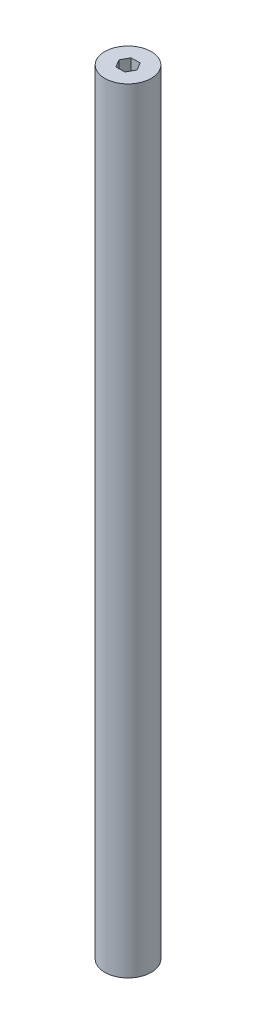
ISO-10303-21;
HEADER;
FILE_DESCRIPTION(('STEP AP214'),'2;1');
FILE_NAME('part.step','',(''),(''),'','','');
FILE_SCHEMA(('AUTOMOTIVE_DESIGN { 1 0 10303 214 1 1 1 1 }'));
ENDSEC;
DATA;
#1=APPLICATION_CONTEXT('core data for automotive mechanical design processes');
#2=APPLICATION_PROTOCOL_DEFINITION('international standard','automotive_design',2000,#1);
#3=PRODUCT_CONTEXT('',#1,'mechanical');
#4=PRODUCT('Part','Part','',(#3));
#5=PRODUCT_RELATED_PRODUCT_CATEGORY('part','',(#4));
#6=PRODUCT_DEFINITION_FORMATION('','',#4);
#7=PRODUCT_DEFINITION_CONTEXT('part definition',#1,'design');
#8=PRODUCT_DEFINITION('design','',#6,#7);
#9=PRODUCT_DEFINITION_SHAPE('','',#8);
#10=(LENGTH_UNIT() NAMED_UNIT(*) SI_UNIT(.MILLI.,.METRE.));
#11=(NAMED_UNIT(*) PLANE_ANGLE_UNIT() SI_UNIT($,.RADIAN.));
#12=(NAMED_UNIT(*) SI_UNIT($,.STERADIAN.) SOLID_ANGLE_UNIT());
#13=UNCERTAINTY_MEASURE_WITH_UNIT(LENGTH_MEASURE(1.E-05),#10,'distance_accuracy_value','');
#14=(GEOMETRIC_REPRESENTATION_CONTEXT(3) GLOBAL_UNCERTAINTY_ASSIGNED_CONTEXT((#13)) GLOBAL_UNIT_ASSIGNED_CONTEXT((#10,
#11,#12)) REPRESENTATION_CONTEXT('',''));
#15=CARTESIAN_POINT('',(0.,0.,0.));
#16=DIRECTION('',(0.,0.,1.));
#17=DIRECTION('',(1.,0.,0.));
#18=AXIS2_PLACEMENT_3D('',#15,#16,#17);
#19=CARTESIAN_POINT('',(0.,635.,0.));
#20=DIRECTION('',(0.,1.,0.));
#21=DIRECTION('',(0.,0.,1.));
#22=AXIS2_PLACEMENT_3D('',#19,#20,#21);
#23=PLANE('',#22);
#24=CARTESIAN_POINT('',(0.,635.,0.));
#25=DIRECTION('',(0.,1.,0.));
#26=DIRECTION('',(0.,0.,1.));
#27=AXIS2_PLACEMENT_3D('',#24,#25,#26);
#28=CIRCLE('',#27,19.05);
#29=CARTESIAN_POINT('',(0.,635.,-19.05));
#30=VERTEX_POINT('',#29);
#31=EDGE_CURVE('E11',#30,#30,#28,.T.);
#32=ORIENTED_EDGE('',*,*,#31,.T.);
#33=EDGE_LOOP('',(#32));
#34=FACE_BOUND('',#33,.T.);
#35=DIRECTION('',(0.485633338163928,0.,-0.874162605505269));
#36=VECTOR('',#35,1.);
#37=CARTESIAN_POINT('',(3.77051612537931,635.,6.28860409642616));
#38=LINE('',#37,#36);
#39=CARTESIAN_POINT('',(3.77051612537931,635.,6.28860409642616));
#40=VERTEX_POINT('',#39);
#41=CARTESIAN_POINT('',(7.3313489645376,635.,-0.121060701744275));
#42=VERTEX_POINT('',#41);
#43=EDGE_CURVE('E100',#40,#42,#38,.T.);
#44=ORIENTED_EDGE('',*,*,#43,.F.);
#45=DIRECTION('',(0.999863692487921,0.,-0.0165104949780338));
#46=VECTOR('',#45,1.);
#47=CARTESIAN_POINT('',(-3.56083283915829,635.,6.40966479817044));
#48=LINE('',#47,#46);
#49=CARTESIAN_POINT('',(-3.56083283915829,635.,6.40966479817044));
#50=VERTEX_POINT('',#49);
#51=EDGE_CURVE('E92',#50,#40,#48,.T.);
#52=ORIENTED_EDGE('',*,*,#51,.F.);
#53=DIRECTION('',(0.514230354323993,0.,0.857652110527235));
#54=VECTOR('',#53,1.);
#55=CARTESIAN_POINT('',(-7.3313489645376,635.,0.121060701744275));
#56=LINE('',#55,#54);
#57=CARTESIAN_POINT('',(-7.3313489645376,635.,0.121060701744275));
#58=VERTEX_POINT('',#57);
#59=EDGE_CURVE('E120',#58,#50,#56,.T.);
#60=ORIENTED_EDGE('',*,*,#59,.F.);
#61=DIRECTION('',(-0.485633338163928,0.,0.874162605505269));
#62=VECTOR('',#61,1.);
#63=CARTESIAN_POINT('',(-3.77051612537931,635.,-6.28860409642616));
#64=LINE('',#63,#62);
#65=CARTESIAN_POINT('',(-3.77051612537931,635.,-6.28860409642616));
#66=VERTEX_POINT('',#65);
#67=EDGE_CURVE('E118',#66,#58,#64,.T.);
#68=ORIENTED_EDGE('',*,*,#67,.F.);
#69=DIRECTION('',(-0.999863692487921,0.,0.0165104949780339));
#70=VECTOR('',#69,1.);
#71=CARTESIAN_POINT('',(3.56083283915829,635.,-6.40966479817044));
#72=LINE('',#71,#70);
#73=CARTESIAN_POINT('',(3.56083283915829,635.,-6.40966479817044));
#74=VERTEX_POINT('',#73);
#75=EDGE_CURVE('E114',#74,#66,#72,.T.);
#76=ORIENTED_EDGE('',*,*,#75,.F.);
#77=DIRECTION('',(-0.514230354323993,0.,-0.857652110527235));
#78=VECTOR('',#77,1.);
#79=CARTESIAN_POINT('',(7.3313489645376,635.,-0.121060701744275));
#80=LINE('',#79,#78);
#81=EDGE_CURVE('E112',#42,#74,#80,.T.);
#82=ORIENTED_EDGE('',*,*,#81,.F.);
#83=EDGE_LOOP('',(#44,#52,#60,#68,#76,#82));
#84=FACE_BOUND('',#83,.T.);
#85=ADVANCED_FACE('F39',(#34,#84),#23,.T.);
#86=CARTESIAN_POINT('',(0.,0.,0.));
#87=DIRECTION('',(0.,1.,0.));
#88=DIRECTION('',(0.,0.,1.));
#89=AXIS2_PLACEMENT_3D('',#86,#87,#88);
#90=PLANE('',#89);
#91=CARTESIAN_POINT('',(0.,0.,0.));
#92=DIRECTION('',(0.,1.,0.));
#93=DIRECTION('',(0.,0.,1.));
#94=AXIS2_PLACEMENT_3D('',#91,#92,#93);
#95=CIRCLE('',#94,19.05);
#96=CARTESIAN_POINT('',(0.,-1.11022302462516E-13,-19.05));
#97=VERTEX_POINT('',#96);
#98=EDGE_CURVE('E43',#97,#97,#95,.T.);
#99=ORIENTED_EDGE('',*,*,#98,.F.);
#100=EDGE_LOOP('',(#99));
#101=FACE_BOUND('',#100,.T.);
#102=DIRECTION('',(0.999863692487921,0.,-0.0165104949780338));
#103=VECTOR('',#102,1.);
#104=CARTESIAN_POINT('',(-3.56083283915829,0.,6.40966479817044));
#105=LINE('',#104,#103);
#106=CARTESIAN_POINT('',(-3.56083283915829,0.,6.40966479817044));
#107=VERTEX_POINT('',#106);
#108=CARTESIAN_POINT('',(3.77051612537931,0.,6.28860409642616));
#109=VERTEX_POINT('',#108);
#110=EDGE_CURVE('E62',#107,#109,#105,.T.);
#111=ORIENTED_EDGE('',*,*,#110,.T.);
#112=DIRECTION('',(0.485633338163928,0.,-0.874162605505269));
#113=VECTOR('',#112,1.);
#114=CARTESIAN_POINT('',(3.77051612537931,0.,6.28860409642616));
#115=LINE('',#114,#113);
#116=CARTESIAN_POINT('',(7.3313489645376,0.,-0.121060701744275));
#117=VERTEX_POINT('',#116);
#118=EDGE_CURVE('E107',#109,#117,#115,.T.);
#119=ORIENTED_EDGE('',*,*,#118,.T.);
#120=DIRECTION('',(-0.514230354323993,0.,-0.857652110527235));
#121=VECTOR('',#120,1.);
#122=CARTESIAN_POINT('',(7.3313489645376,0.,-0.121060701744275));
#123=LINE('',#122,#121);
#124=CARTESIAN_POINT('',(3.56083283915829,0.,-6.40966479817044));
#125=VERTEX_POINT('',#124);
#126=EDGE_CURVE('E124',#117,#125,#123,.T.);
#127=ORIENTED_EDGE('',*,*,#126,.T.);
#128=DIRECTION('',(-0.999863692487921,0.,0.0165104949780339));
#129=VECTOR('',#128,1.);
#130=CARTESIAN_POINT('',(3.56083283915829,0.,-6.40966479817044));
#131=LINE('',#130,#129);
#132=CARTESIAN_POINT('',(-3.77051612537931,0.,-6.28860409642616));
#133=VERTEX_POINT('',#132);
#134=EDGE_CURVE('E127',#125,#133,#131,.T.);
#135=ORIENTED_EDGE('',*,*,#134,.T.);
#136=DIRECTION('',(-0.485633338163928,0.,0.874162605505269));
#137=VECTOR('',#136,1.);
#138=CARTESIAN_POINT('',(-3.77051612537931,0.,-6.28860409642616));
#139=LINE('',#138,#137);
#140=CARTESIAN_POINT('',(-7.3313489645376,0.,0.121060701744275));
#141=VERTEX_POINT('',#140);
#142=EDGE_CURVE('E130',#133,#141,#139,.T.);
#143=ORIENTED_EDGE('',*,*,#142,.T.);
#144=DIRECTION('',(0.514230354323993,0.,0.857652110527235));
#145=VECTOR('',#144,1.);
#146=CARTESIAN_POINT('',(-7.3313489645376,0.,0.121060701744275));
#147=LINE('',#146,#145);
#148=EDGE_CURVE('E101',#141,#107,#147,.T.);
#149=ORIENTED_EDGE('',*,*,#148,.T.);
#150=EDGE_LOOP('',(#111,#119,#127,#135,#143,#149));
#151=FACE_BOUND('',#150,.T.);
#152=ADVANCED_FACE('F147',(#101,#151),#90,.F.);
#153=CARTESIAN_POINT('',(0.,635.,0.));
#154=DIRECTION('',(0.,-1.,0.));
#155=DIRECTION('',(0.,0.,-1.));
#156=AXIS2_PLACEMENT_3D('',#153,#154,#155);
#157=CYLINDRICAL_SURFACE('',#156,19.05);
#158=CARTESIAN_POINT('',(0.,635.,-19.05));
#159=CARTESIAN_POINT('',(0.,628.385416666667,-19.05));
#160=CARTESIAN_POINT('',(0.,621.770833333333,-19.05));
#161=CARTESIAN_POINT('',(0.,608.541666666667,-19.05));
#162=CARTESIAN_POINT('',(0.,601.927083333333,-19.05));
#163=CARTESIAN_POINT('',(0.,588.697916666667,-19.05));
#164=CARTESIAN_POINT('',(0.,582.083333333333,-19.05));
#165=CARTESIAN_POINT('',(0.,568.854166666667,-19.05));
#166=CARTESIAN_POINT('',(0.,562.239583333333,-19.05));
#167=CARTESIAN_POINT('',(0.,549.010416666667,-19.05));
#168=CARTESIAN_POINT('',(0.,542.395833333333,-19.05));
#169=CARTESIAN_POINT('',(0.,529.166666666667,-19.05));
#170=CARTESIAN_POINT('',(0.,522.552083333333,-19.05));
#171=CARTESIAN_POINT('',(0.,509.322916666667,-19.05));
#172=CARTESIAN_POINT('',(0.,502.708333333333,-19.05));
#173=CARTESIAN_POINT('',(0.,489.479166666667,-19.05));
#174=CARTESIAN_POINT('',(0.,482.864583333333,-19.05));
#175=CARTESIAN_POINT('',(0.,469.635416666667,-19.05));
#176=CARTESIAN_POINT('',(0.,463.020833333333,-19.05));
#177=CARTESIAN_POINT('',(0.,449.791666666667,-19.05));
#178=CARTESIAN_POINT('',(0.,443.177083333333,-19.05));
#179=CARTESIAN_POINT('',(0.,429.947916666667,-19.05));
#180=CARTESIAN_POINT('',(0.,423.333333333333,-19.05));
#181=CARTESIAN_POINT('',(0.,410.104166666667,-19.05));
#182=CARTESIAN_POINT('',(0.,403.489583333333,-19.05));
#183=CARTESIAN_POINT('',(0.,390.260416666667,-19.05));
#184=CARTESIAN_POINT('',(0.,383.645833333333,-19.05));
#185=CARTESIAN_POINT('',(0.,370.416666666667,-19.05));
#186=CARTESIAN_POINT('',(0.,363.802083333333,-19.05));
#187=CARTESIAN_POINT('',(0.,350.572916666667,-19.05));
#188=CARTESIAN_POINT('',(0.,343.958333333333,-19.05));
#189=CARTESIAN_POINT('',(0.,330.729166666667,-19.05));
#190=CARTESIAN_POINT('',(0.,324.114583333333,-19.05));
#191=CARTESIAN_POINT('',(0.,310.885416666667,-19.05));
#192=CARTESIAN_POINT('',(0.,304.270833333333,-19.05));
#193=CARTESIAN_POINT('',(0.,291.041666666667,-19.05));
#194=CARTESIAN_POINT('',(0.,284.427083333333,-19.05));
#195=CARTESIAN_POINT('',(0.,271.197916666667,-19.05));
#196=CARTESIAN_POINT('',(0.,264.583333333333,-19.05));
#197=CARTESIAN_POINT('',(0.,251.354166666667,-19.05));
#198=CARTESIAN_POINT('',(0.,244.739583333333,-19.05));
#199=CARTESIAN_POINT('',(0.,231.510416666667,-19.05));
#200=CARTESIAN_POINT('',(0.,224.895833333333,-19.05));
#201=CARTESIAN_POINT('',(0.,211.666666666667,-19.05));
#202=CARTESIAN_POINT('',(0.,205.052083333333,-19.05));
#203=CARTESIAN_POINT('',(0.,191.822916666667,-19.05));
#204=CARTESIAN_POINT('',(0.,185.208333333333,-19.05));
#205=CARTESIAN_POINT('',(0.,171.979166666667,-19.05));
#206=CARTESIAN_POINT('',(0.,165.364583333333,-19.05));
#207=CARTESIAN_POINT('',(0.,152.135416666667,-19.05));
#208=CARTESIAN_POINT('',(0.,145.520833333333,-19.05));
#209=CARTESIAN_POINT('',(0.,132.291666666667,-19.05));
#210=CARTESIAN_POINT('',(0.,125.677083333333,-19.05));
#211=CARTESIAN_POINT('',(0.,112.447916666667,-19.05));
#212=CARTESIAN_POINT('',(0.,105.833333333333,-19.05));
#213=CARTESIAN_POINT('',(0.,92.6041666666666,-19.05));
#214=CARTESIAN_POINT('',(0.,85.9895833333332,-19.05));
#215=CARTESIAN_POINT('',(0.,72.7604166666665,-19.05));
#216=CARTESIAN_POINT('',(0.,66.1458333333332,-19.05));
#217=CARTESIAN_POINT('',(0.,52.9166666666666,-19.05));
#218=CARTESIAN_POINT('',(0.,46.3020833333332,-19.05));
#219=CARTESIAN_POINT('',(0.,33.0729166666666,-19.05));
#220=CARTESIAN_POINT('',(0.,26.4583333333333,-19.05));
#221=CARTESIAN_POINT('',(0.,13.2291666666666,-19.05));
#222=CARTESIAN_POINT('',(0.,6.61458333333324,-19.05));
#223=CARTESIAN_POINT('',(0.,-1.11022302462516E-13,-19.05));
#224=B_SPLINE_CURVE_WITH_KNOTS('',3,(#158,#159,#160,#161,#162,#163,#164,#165,#166,#167,#168,
#169,#170,#171,#172,#173,#174,#175,#176,#177,#178,#179,#180,#181,#182,#183,#184,#185,#186,#187,
#188,#189,#190,#191,#192,#193,#194,#195,#196,#197,#198,#199,#200,#201,#202,#203,#204,#205,#206,
#207,#208,#209,#210,#211,#212,#213,#214,#215,#216,#217,#218,#219,#220,#221,#222,#223),
.UNSPECIFIED.,.F.,.F.,(4,2,2,2,2,2,2,2,2,2,2,2,2,2,2,2,2,2,2,2,2,2,2,2,2,2,2,2,2,2,2,2,4),(0.,
19.8437499999999,39.6875,59.5312499999999,79.375,99.2187499999999,119.0625,138.90625,158.75,
178.59375,198.4375,218.28125,238.125,257.96875,277.8125,297.65625,317.5,337.34375,357.1875,
377.03125,396.875,416.71875,436.5625,456.40625,476.25,496.09375,515.9375,535.78125,555.625,
575.46875,595.3125,615.15625,635.),.UNSPECIFIED.);
#225=EDGE_CURVE('BSEAM41',#30,#97,#224,.T.);
#226=ORIENTED_EDGE('',*,*,#31,.F.);
#227=ORIENTED_EDGE('',*,*,#98,.T.);
#228=ORIENTED_EDGE('',*,*,#225,.T.);
#229=ORIENTED_EDGE('',*,*,#225,.F.);
#230=EDGE_LOOP('',(#226,#228,#227,#229));
#231=FACE_BOUND('',#230,.T.);
#232=ADVANCED_FACE('F41',(#231),#157,.T.);
#233=CARTESIAN_POINT('',(-3.56083283915829,635.,6.40966479817044));
#234=DIRECTION('',(-0.0165104949780338,0.,-0.999863692487921));
#235=DIRECTION('',(-0.999863692487921,0.,0.0165104949780338));
#236=AXIS2_PLACEMENT_3D('',#233,#234,#235);
#237=PLANE('',#236);
#238=ORIENTED_EDGE('',*,*,#110,.F.);
#239=DIRECTION('',(0.,-1.,0.));
#240=VECTOR('',#239,1.);
#241=CARTESIAN_POINT('',(-3.56083283915829,635.,6.40966479817044));
#242=LINE('',#241,#240);
#243=EDGE_CURVE('E96',#50,#107,#242,.T.);
#244=ORIENTED_EDGE('',*,*,#243,.F.);
#245=ORIENTED_EDGE('',*,*,#51,.T.);
#246=DIRECTION('',(0.,-1.,0.));
#247=VECTOR('',#246,1.);
#248=CARTESIAN_POINT('',(3.77051612537931,635.,6.28860409642616));
#249=LINE('',#248,#247);
#250=EDGE_CURVE('E95',#40,#109,#249,.T.);
#251=ORIENTED_EDGE('',*,*,#250,.T.);
#252=EDGE_LOOP('',(#238,#244,#245,#251));
#253=FACE_BOUND('',#252,.T.);
#254=ADVANCED_FACE('F94',(#253),#237,.T.);
#255=CARTESIAN_POINT('',(3.77051612537931,635.,6.28860409642616));
#256=DIRECTION('',(-0.874162605505269,0.,-0.485633338163928));
#257=DIRECTION('',(-0.485633338163928,0.,0.874162605505269));
#258=AXIS2_PLACEMENT_3D('',#255,#256,#257);
#259=PLANE('',#258);
#260=ORIENTED_EDGE('',*,*,#118,.F.);
#261=ORIENTED_EDGE('',*,*,#250,.F.);
#262=ORIENTED_EDGE('',*,*,#43,.T.);
#263=DIRECTION('',(0.,-1.,0.));
#264=VECTOR('',#263,1.);
#265=CARTESIAN_POINT('',(7.3313489645376,635.,-0.121060701744275));
#266=LINE('',#265,#264);
#267=EDGE_CURVE('E108',#42,#117,#266,.T.);
#268=ORIENTED_EDGE('',*,*,#267,.T.);
#269=EDGE_LOOP('',(#260,#261,#262,#268));
#270=FACE_BOUND('',#269,.T.);
#271=ADVANCED_FACE('F104',(#270),#259,.T.);
#272=CARTESIAN_POINT('',(7.3313489645376,635.,-0.121060701744275));
#273=DIRECTION('',(-0.857652110527235,0.,0.514230354323993));
#274=DIRECTION('',(0.514230354323993,0.,0.857652110527235));
#275=AXIS2_PLACEMENT_3D('',#272,#273,#274);
#276=PLANE('',#275);
#277=ORIENTED_EDGE('',*,*,#126,.F.);
#278=ORIENTED_EDGE('',*,*,#267,.F.);
#279=ORIENTED_EDGE('',*,*,#81,.T.);
#280=DIRECTION('',(0.,-1.,0.));
#281=VECTOR('',#280,1.);
#282=CARTESIAN_POINT('',(3.56083283915829,635.,-6.40966479817044));
#283=LINE('',#282,#281);
#284=EDGE_CURVE('E139',#74,#125,#283,.T.);
#285=ORIENTED_EDGE('',*,*,#284,.T.);
#286=EDGE_LOOP('',(#277,#278,#279,#285));
#287=FACE_BOUND('',#286,.T.);
#288=ADVANCED_FACE('F143',(#287),#276,.T.);
#289=CARTESIAN_POINT('',(3.56083283915829,635.,-6.40966479817044));
#290=DIRECTION('',(0.0165104949780339,0.,0.999863692487921));
#291=DIRECTION('',(0.999863692487921,0.,-0.0165104949780339));
#292=AXIS2_PLACEMENT_3D('',#289,#290,#291);
#293=PLANE('',#292);
#294=ORIENTED_EDGE('',*,*,#134,.F.);
#295=ORIENTED_EDGE('',*,*,#284,.F.);
#296=ORIENTED_EDGE('',*,*,#75,.T.);
#297=DIRECTION('',(0.,-1.,0.));
#298=VECTOR('',#297,1.);
#299=CARTESIAN_POINT('',(-3.77051612537931,635.,-6.28860409642616));
#300=LINE('',#299,#298);
#301=EDGE_CURVE('E137',#66,#133,#300,.T.);
#302=ORIENTED_EDGE('',*,*,#301,.T.);
#303=EDGE_LOOP('',(#294,#295,#296,#302));
#304=FACE_BOUND('',#303,.T.);
#305=ADVANCED_FACE('F155',(#304),#293,.T.);
#306=CARTESIAN_POINT('',(-3.77051612537931,635.,-6.28860409642616));
#307=DIRECTION('',(0.874162605505269,0.,0.485633338163928));
#308=DIRECTION('',(0.485633338163928,0.,-0.874162605505269));
#309=AXIS2_PLACEMENT_3D('',#306,#307,#308);
#310=PLANE('',#309);
#311=ORIENTED_EDGE('',*,*,#142,.F.);
#312=ORIENTED_EDGE('',*,*,#301,.F.);
#313=ORIENTED_EDGE('',*,*,#67,.T.);
#314=DIRECTION('',(0.,-1.,0.));
#315=VECTOR('',#314,1.);
#316=CARTESIAN_POINT('',(-7.3313489645376,635.,0.121060701744275));
#317=LINE('',#316,#315);
#318=EDGE_CURVE('E54',#58,#141,#317,.T.);
#319=ORIENTED_EDGE('',*,*,#318,.T.);
#320=EDGE_LOOP('',(#311,#312,#313,#319));
#321=FACE_BOUND('',#320,.T.);
#322=ADVANCED_FACE('F153',(#321),#310,.T.);
#323=CARTESIAN_POINT('',(-7.3313489645376,635.,0.121060701744275));
#324=DIRECTION('',(0.857652110527235,0.,-0.514230354323993));
#325=DIRECTION('',(-0.514230354323993,0.,-0.857652110527235));
#326=AXIS2_PLACEMENT_3D('',#323,#324,#325);
#327=PLANE('',#326);
#328=ORIENTED_EDGE('',*,*,#148,.F.);
#329=ORIENTED_EDGE('',*,*,#318,.F.);
#330=ORIENTED_EDGE('',*,*,#59,.T.);
#331=ORIENTED_EDGE('',*,*,#243,.T.);
#332=EDGE_LOOP('',(#328,#329,#330,#331));
#333=FACE_BOUND('',#332,.T.);
#334=ADVANCED_FACE('F149',(#333),#327,.T.);
#335=CLOSED_SHELL('',(#85,#152,#232,#254,#271,#288,#305,#322,#334));
#336=MANIFOLD_SOLID_BREP('B2',#335);
#337=ADVANCED_BREP_SHAPE_REPRESENTATION('',(#18,#336),#14);
#338=SHAPE_DEFINITION_REPRESENTATION(#9,#337);
ENDSEC;
END-ISO-10303-21;
